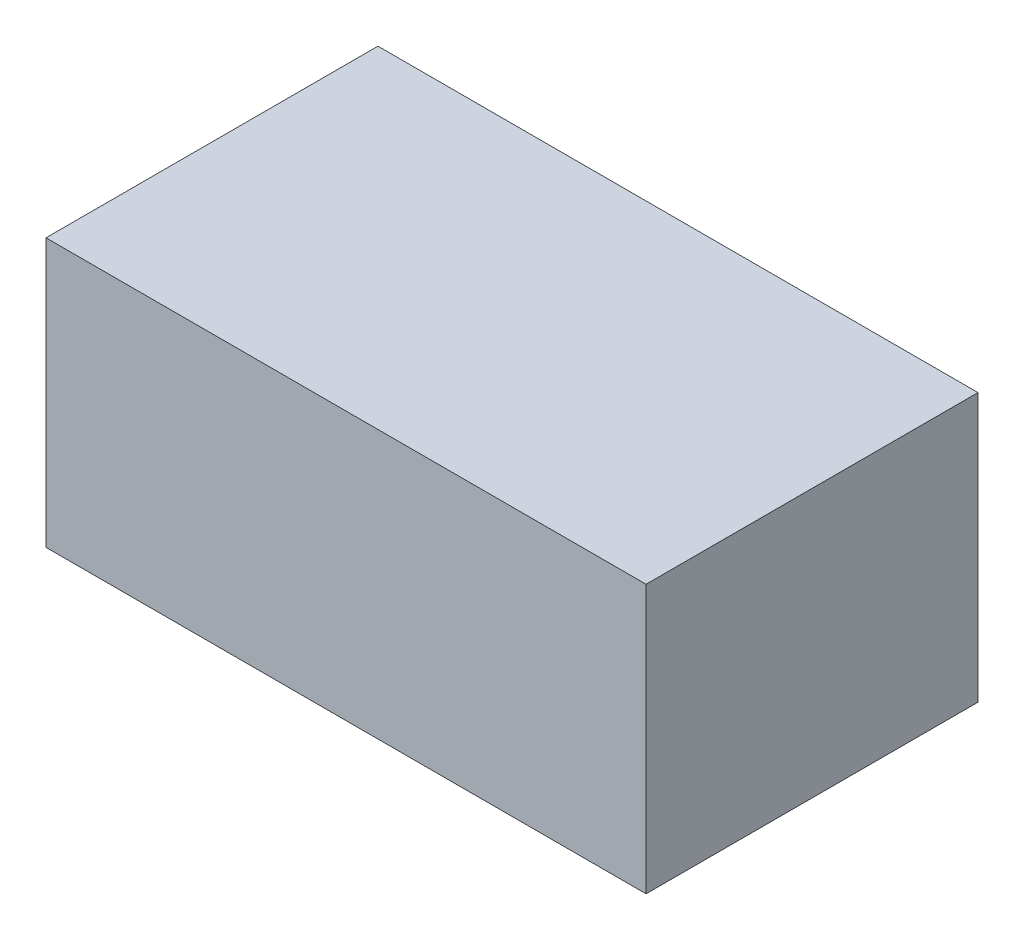
ISO-10303-21;
HEADER;
FILE_DESCRIPTION(('STEP AP214'),'2;1');
FILE_NAME('part.step','',(''),(''),'','','');
FILE_SCHEMA(('AUTOMOTIVE_DESIGN { 1 0 10303 214 1 1 1 1 }'));
ENDSEC;
DATA;
#1=APPLICATION_CONTEXT('core data for automotive mechanical design processes');
#2=APPLICATION_PROTOCOL_DEFINITION('international standard','automotive_design',2000,#1);
#3=PRODUCT_CONTEXT('',#1,'mechanical');
#4=PRODUCT('Part','Part','',(#3));
#5=PRODUCT_RELATED_PRODUCT_CATEGORY('part','',(#4));
#6=PRODUCT_DEFINITION_FORMATION('','',#4);
#7=PRODUCT_DEFINITION_CONTEXT('part definition',#1,'design');
#8=PRODUCT_DEFINITION('design','',#6,#7);
#9=PRODUCT_DEFINITION_SHAPE('','',#8);
#10=(LENGTH_UNIT() NAMED_UNIT(*) SI_UNIT(.MILLI.,.METRE.));
#11=(NAMED_UNIT(*) PLANE_ANGLE_UNIT() SI_UNIT($,.RADIAN.));
#12=(NAMED_UNIT(*) SI_UNIT($,.STERADIAN.) SOLID_ANGLE_UNIT());
#13=UNCERTAINTY_MEASURE_WITH_UNIT(LENGTH_MEASURE(1.E-05),#10,'distance_accuracy_value','');
#14=(GEOMETRIC_REPRESENTATION_CONTEXT(3) GLOBAL_UNCERTAINTY_ASSIGNED_CONTEXT((#13)) GLOBAL_UNIT_ASSIGNED_CONTEXT((#10,
#11,#12)) REPRESENTATION_CONTEXT('',''));
#15=CARTESIAN_POINT('',(0.,0.,0.));
#16=DIRECTION('',(0.,0.,1.));
#17=DIRECTION('',(1.,0.,0.));
#18=AXIS2_PLACEMENT_3D('',#15,#16,#17);
#19=CARTESIAN_POINT('',(-23.5,21.,-13.));
#20=DIRECTION('',(1.,0.,0.));
#21=DIRECTION('',(0.,0.,-1.));
#22=AXIS2_PLACEMENT_3D('',#19,#20,#21);
#23=PLANE('',#22);
#24=DIRECTION('',(0.,0.,1.));
#25=VECTOR('',#24,1.);
#26=CARTESIAN_POINT('',(-23.5,0.,-13.));
#27=LINE('',#26,#25);
#28=CARTESIAN_POINT('',(-23.5,0.,-13.));
#29=VERTEX_POINT('',#28);
#30=CARTESIAN_POINT('',(-23.5,0.,13.));
#31=VERTEX_POINT('',#30);
#32=EDGE_CURVE('E96',#29,#31,#27,.T.);
#33=ORIENTED_EDGE('',*,*,#32,.T.);
#34=DIRECTION('',(0.,-1.,0.));
#35=VECTOR('',#34,1.);
#36=CARTESIAN_POINT('',(-23.5,21.,13.));
#37=LINE('',#36,#35);
#38=CARTESIAN_POINT('',(-23.5,21.,13.));
#39=VERTEX_POINT('',#38);
#40=EDGE_CURVE('E11',#39,#31,#37,.T.);
#41=ORIENTED_EDGE('',*,*,#40,.F.);
#42=DIRECTION('',(0.,0.,1.));
#43=VECTOR('',#42,1.);
#44=CARTESIAN_POINT('',(-23.5,21.,-13.));
#45=LINE('',#44,#43);
#46=CARTESIAN_POINT('',(-23.5,21.,-13.));
#47=VERTEX_POINT('',#46);
#48=EDGE_CURVE('E82',#47,#39,#45,.T.);
#49=ORIENTED_EDGE('',*,*,#48,.F.);
#50=DIRECTION('',(0.,-1.,0.));
#51=VECTOR('',#50,1.);
#52=CARTESIAN_POINT('',(-23.5,21.,-13.));
#53=LINE('',#52,#51);
#54=EDGE_CURVE('E49',#47,#29,#53,.T.);
#55=ORIENTED_EDGE('',*,*,#54,.T.);
#56=EDGE_LOOP('',(#33,#41,#49,#55));
#57=FACE_BOUND('',#56,.T.);
#58=ADVANCED_FACE('F33',(#57),#23,.F.);
#59=CARTESIAN_POINT('',(-23.5,21.,13.));
#60=DIRECTION('',(0.,0.,-1.));
#61=DIRECTION('',(-1.,0.,0.));
#62=AXIS2_PLACEMENT_3D('',#59,#60,#61);
#63=PLANE('',#62);
#64=DIRECTION('',(1.,0.,0.));
#65=VECTOR('',#64,1.);
#66=CARTESIAN_POINT('',(-23.5,0.,13.));
#67=LINE('',#66,#65);
#68=CARTESIAN_POINT('',(23.5,0.,13.));
#69=VERTEX_POINT('',#68);
#70=EDGE_CURVE('E87',#31,#69,#67,.T.);
#71=ORIENTED_EDGE('',*,*,#70,.T.);
#72=DIRECTION('',(0.,-1.,0.));
#73=VECTOR('',#72,1.);
#74=CARTESIAN_POINT('',(23.5,21.,13.));
#75=LINE('',#74,#73);
#76=CARTESIAN_POINT('',(23.5,21.,13.));
#77=VERTEX_POINT('',#76);
#78=EDGE_CURVE('E41',#77,#69,#75,.T.);
#79=ORIENTED_EDGE('',*,*,#78,.F.);
#80=DIRECTION('',(1.,0.,0.));
#81=VECTOR('',#80,1.);
#82=CARTESIAN_POINT('',(-23.5,21.,13.));
#83=LINE('',#82,#81);
#84=EDGE_CURVE('E74',#39,#77,#83,.T.);
#85=ORIENTED_EDGE('',*,*,#84,.F.);
#86=ORIENTED_EDGE('',*,*,#40,.T.);
#87=EDGE_LOOP('',(#71,#79,#85,#86));
#88=FACE_BOUND('',#87,.T.);
#89=ADVANCED_FACE('F86',(#88),#63,.F.);
#90=CARTESIAN_POINT('',(23.5,21.,-13.));
#91=DIRECTION('',(1.,0.,0.));
#92=DIRECTION('',(0.,0.,-1.));
#93=AXIS2_PLACEMENT_3D('',#90,#91,#92);
#94=PLANE('',#93);
#95=DIRECTION('',(0.,0.,1.));
#96=VECTOR('',#95,1.);
#97=CARTESIAN_POINT('',(23.5,0.,-13.));
#98=LINE('',#97,#96);
#99=CARTESIAN_POINT('',(23.5,0.,-13.));
#100=VERTEX_POINT('',#99);
#101=EDGE_CURVE('E99',#100,#69,#98,.T.);
#102=ORIENTED_EDGE('',*,*,#101,.F.);
#103=DIRECTION('',(0.,-1.,0.));
#104=VECTOR('',#103,1.);
#105=CARTESIAN_POINT('',(23.5,21.,-13.));
#106=LINE('',#105,#104);
#107=CARTESIAN_POINT('',(23.5,21.,-13.));
#108=VERTEX_POINT('',#107);
#109=EDGE_CURVE('E63',#108,#100,#106,.T.);
#110=ORIENTED_EDGE('',*,*,#109,.F.);
#111=DIRECTION('',(0.,0.,1.));
#112=VECTOR('',#111,1.);
#113=CARTESIAN_POINT('',(23.5,21.,-13.));
#114=LINE('',#113,#112);
#115=EDGE_CURVE('E81',#108,#77,#114,.T.);
#116=ORIENTED_EDGE('',*,*,#115,.T.);
#117=ORIENTED_EDGE('',*,*,#78,.T.);
#118=EDGE_LOOP('',(#102,#110,#116,#117));
#119=FACE_BOUND('',#118,.T.);
#120=ADVANCED_FACE('F90',(#119),#94,.T.);
#121=CARTESIAN_POINT('',(-23.5,21.,-13.));
#122=DIRECTION('',(0.,0.,-1.));
#123=DIRECTION('',(-1.,0.,0.));
#124=AXIS2_PLACEMENT_3D('',#121,#122,#123);
#125=PLANE('',#124);
#126=DIRECTION('',(1.,0.,0.));
#127=VECTOR('',#126,1.);
#128=CARTESIAN_POINT('',(-23.5,0.,-13.));
#129=LINE('',#128,#127);
#130=EDGE_CURVE('E101',#29,#100,#129,.T.);
#131=ORIENTED_EDGE('',*,*,#130,.F.);
#132=ORIENTED_EDGE('',*,*,#54,.F.);
#133=DIRECTION('',(1.,0.,0.));
#134=VECTOR('',#133,1.);
#135=CARTESIAN_POINT('',(-23.5,21.,-13.));
#136=LINE('',#135,#134);
#137=EDGE_CURVE('E91',#47,#108,#136,.T.);
#138=ORIENTED_EDGE('',*,*,#137,.T.);
#139=ORIENTED_EDGE('',*,*,#109,.T.);
#140=EDGE_LOOP('',(#131,#132,#138,#139));
#141=FACE_BOUND('',#140,.T.);
#142=ADVANCED_FACE('F107',(#141),#125,.T.);
#143=CARTESIAN_POINT('',(0.,21.,0.));
#144=DIRECTION('',(0.,1.,0.));
#145=DIRECTION('',(0.,0.,1.));
#146=AXIS2_PLACEMENT_3D('',#143,#144,#145);
#147=PLANE('',#146);
#148=ORIENTED_EDGE('',*,*,#48,.T.);
#149=ORIENTED_EDGE('',*,*,#84,.T.);
#150=ORIENTED_EDGE('',*,*,#115,.F.);
#151=ORIENTED_EDGE('',*,*,#137,.F.);
#152=EDGE_LOOP('',(#148,#149,#150,#151));
#153=FACE_BOUND('',#152,.T.);
#154=ADVANCED_FACE('F78',(#153),#147,.T.);
#155=CARTESIAN_POINT('',(0.,0.,0.));
#156=DIRECTION('',(0.,1.,0.));
#157=DIRECTION('',(0.,0.,1.));
#158=AXIS2_PLACEMENT_3D('',#155,#156,#157);
#159=PLANE('',#158);
#160=ORIENTED_EDGE('',*,*,#32,.F.);
#161=ORIENTED_EDGE('',*,*,#130,.T.);
#162=ORIENTED_EDGE('',*,*,#101,.T.);
#163=ORIENTED_EDGE('',*,*,#70,.F.);
#164=EDGE_LOOP('',(#160,#161,#162,#163));
#165=FACE_BOUND('',#164,.T.);
#166=ADVANCED_FACE('F106',(#165),#159,.F.);
#167=CLOSED_SHELL('',(#58,#89,#120,#142,#154,#166));
#168=MANIFOLD_SOLID_BREP('B2',#167);
#169=ADVANCED_BREP_SHAPE_REPRESENTATION('',(#18,#168),#14);
#170=SHAPE_DEFINITION_REPRESENTATION(#9,#169);
ENDSEC;
END-ISO-10303-21;
